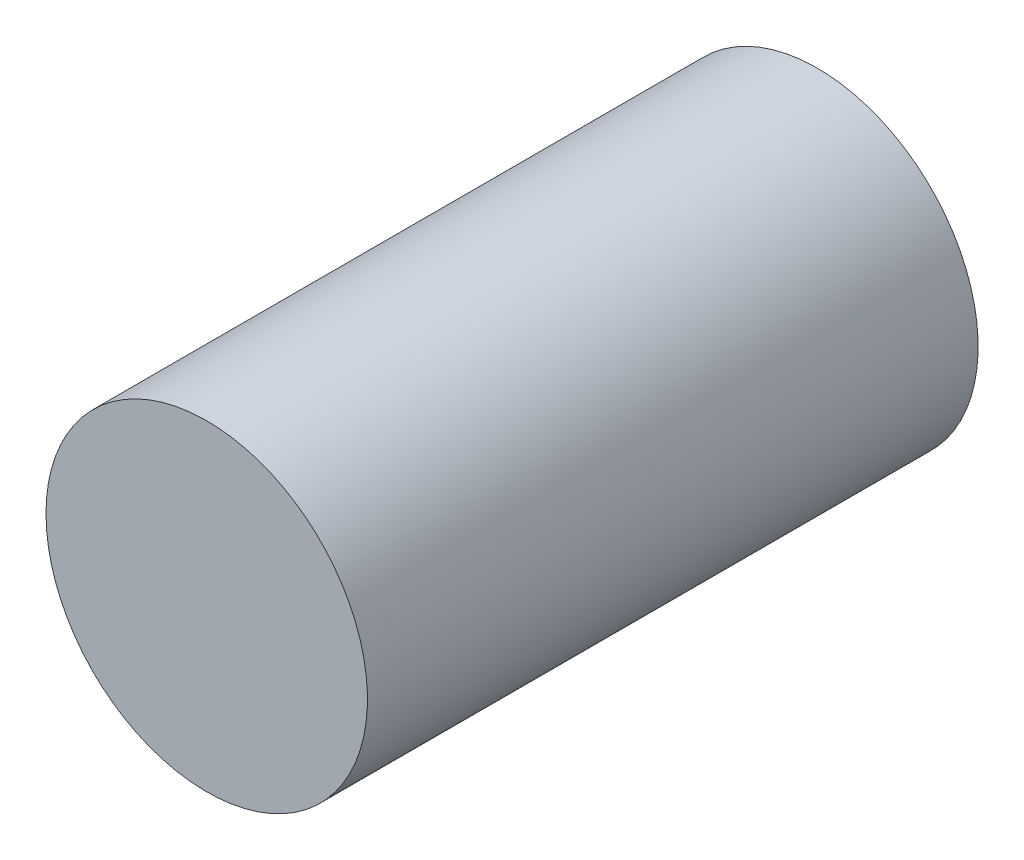
ISO-10303-21;
HEADER;
FILE_DESCRIPTION(('STEP AP214'),'2;1');
FILE_NAME('part.step','',(''),(''),'','','');
FILE_SCHEMA(('AUTOMOTIVE_DESIGN { 1 0 10303 214 1 1 1 1 }'));
ENDSEC;
DATA;
#1=APPLICATION_CONTEXT('core data for automotive mechanical design processes');
#2=APPLICATION_PROTOCOL_DEFINITION('international standard','automotive_design',2000,#1);
#3=PRODUCT_CONTEXT('',#1,'mechanical');
#4=PRODUCT('Part','Part','',(#3));
#5=PRODUCT_RELATED_PRODUCT_CATEGORY('part','',(#4));
#6=PRODUCT_DEFINITION_FORMATION('','',#4);
#7=PRODUCT_DEFINITION_CONTEXT('part definition',#1,'design');
#8=PRODUCT_DEFINITION('design','',#6,#7);
#9=PRODUCT_DEFINITION_SHAPE('','',#8);
#10=(LENGTH_UNIT() NAMED_UNIT(*) SI_UNIT(.MILLI.,.METRE.));
#11=(NAMED_UNIT(*) PLANE_ANGLE_UNIT() SI_UNIT($,.RADIAN.));
#12=(NAMED_UNIT(*) SI_UNIT($,.STERADIAN.) SOLID_ANGLE_UNIT());
#13=UNCERTAINTY_MEASURE_WITH_UNIT(LENGTH_MEASURE(1.E-05),#10,'distance_accuracy_value','');
#14=(GEOMETRIC_REPRESENTATION_CONTEXT(3) GLOBAL_UNCERTAINTY_ASSIGNED_CONTEXT((#13)) GLOBAL_UNIT_ASSIGNED_CONTEXT((#10,
#11,#12)) REPRESENTATION_CONTEXT('',''));
#15=CARTESIAN_POINT('',(0.,0.,0.));
#16=DIRECTION('',(0.,0.,1.));
#17=DIRECTION('',(1.,0.,0.));
#18=AXIS2_PLACEMENT_3D('',#15,#16,#17);
#19=CARTESIAN_POINT('',(0.,0.,3.8));
#20=DIRECTION('',(0.,0.,-1.));
#21=DIRECTION('',(-1.,0.,0.));
#22=AXIS2_PLACEMENT_3D('',#19,#20,#21);
#23=CYLINDRICAL_SURFACE('',#22,1.);
#24=CARTESIAN_POINT('',(0.,0.,3.8));
#25=DIRECTION('',(0.,0.,1.));
#26=DIRECTION('',(1.,0.,0.));
#27=AXIS2_PLACEMENT_3D('',#24,#25,#26);
#28=CIRCLE('',#27,1.);
#29=CARTESIAN_POINT('',(-1.,0.,3.8));
#30=VERTEX_POINT('',#29);
#31=EDGE_CURVE('E10',#30,#30,#28,.T.);
#32=CARTESIAN_POINT('',(0.,0.,0.));
#33=DIRECTION('',(0.,0.,1.));
#34=DIRECTION('',(1.,0.,0.));
#35=AXIS2_PLACEMENT_3D('',#32,#33,#34);
#36=CIRCLE('',#35,1.);
#37=CARTESIAN_POINT('',(-1.,0.,0.));
#38=VERTEX_POINT('',#37);
#39=EDGE_CURVE('E40',#38,#38,#36,.T.);
#40=CARTESIAN_POINT('',(-1.,0.,3.8));
#41=CARTESIAN_POINT('',(-1.,0.,3.76041666666667));
#42=CARTESIAN_POINT('',(-1.,0.,3.72083333333333));
#43=CARTESIAN_POINT('',(-1.,0.,3.64166666666667));
#44=CARTESIAN_POINT('',(-1.,0.,3.60208333333333));
#45=CARTESIAN_POINT('',(-1.,0.,3.52291666666667));
#46=CARTESIAN_POINT('',(-1.,0.,3.48333333333333));
#47=CARTESIAN_POINT('',(-1.,0.,3.40416666666667));
#48=CARTESIAN_POINT('',(-1.,0.,3.36458333333333));
#49=CARTESIAN_POINT('',(-1.,0.,3.28541666666667));
#50=CARTESIAN_POINT('',(-1.,0.,3.24583333333333));
#51=CARTESIAN_POINT('',(-1.,0.,3.16666666666667));
#52=CARTESIAN_POINT('',(-1.,0.,3.12708333333333));
#53=CARTESIAN_POINT('',(-1.,0.,3.04791666666667));
#54=CARTESIAN_POINT('',(-1.,0.,3.00833333333333));
#55=CARTESIAN_POINT('',(-1.,0.,2.92916666666667));
#56=CARTESIAN_POINT('',(-1.,0.,2.88958333333333));
#57=CARTESIAN_POINT('',(-1.,0.,2.81041666666667));
#58=CARTESIAN_POINT('',(-1.,0.,2.77083333333333));
#59=CARTESIAN_POINT('',(-1.,0.,2.69166666666667));
#60=CARTESIAN_POINT('',(-1.,0.,2.65208333333333));
#61=CARTESIAN_POINT('',(-1.,0.,2.57291666666667));
#62=CARTESIAN_POINT('',(-1.,0.,2.53333333333333));
#63=CARTESIAN_POINT('',(-1.,0.,2.45416666666667));
#64=CARTESIAN_POINT('',(-1.,0.,2.41458333333333));
#65=CARTESIAN_POINT('',(-1.,0.,2.33541666666667));
#66=CARTESIAN_POINT('',(-1.,0.,2.29583333333333));
#67=CARTESIAN_POINT('',(-1.,0.,2.21666666666667));
#68=CARTESIAN_POINT('',(-1.,0.,2.17708333333333));
#69=CARTESIAN_POINT('',(-1.,0.,2.09791666666667));
#70=CARTESIAN_POINT('',(-1.,0.,2.05833333333333));
#71=CARTESIAN_POINT('',(-1.,0.,1.97916666666667));
#72=CARTESIAN_POINT('',(-1.,0.,1.93958333333333));
#73=CARTESIAN_POINT('',(-1.,0.,1.86041666666667));
#74=CARTESIAN_POINT('',(-1.,0.,1.82083333333333));
#75=CARTESIAN_POINT('',(-1.,0.,1.74166666666667));
#76=CARTESIAN_POINT('',(-1.,0.,1.70208333333333));
#77=CARTESIAN_POINT('',(-1.,0.,1.62291666666667));
#78=CARTESIAN_POINT('',(-1.,0.,1.58333333333333));
#79=CARTESIAN_POINT('',(-1.,0.,1.50416666666667));
#80=CARTESIAN_POINT('',(-1.,0.,1.46458333333333));
#81=CARTESIAN_POINT('',(-1.,0.,1.38541666666667));
#82=CARTESIAN_POINT('',(-1.,0.,1.34583333333333));
#83=CARTESIAN_POINT('',(-1.,0.,1.26666666666667));
#84=CARTESIAN_POINT('',(-1.,0.,1.22708333333333));
#85=CARTESIAN_POINT('',(-1.,0.,1.14791666666667));
#86=CARTESIAN_POINT('',(-1.,0.,1.10833333333333));
#87=CARTESIAN_POINT('',(-1.,0.,1.02916666666667));
#88=CARTESIAN_POINT('',(-1.,0.,0.989583333333333));
#89=CARTESIAN_POINT('',(-1.,0.,0.910416666666667));
#90=CARTESIAN_POINT('',(-1.,0.,0.870833333333333));
#91=CARTESIAN_POINT('',(-1.,0.,0.791666666666667));
#92=CARTESIAN_POINT('',(-1.,0.,0.752083333333333));
#93=CARTESIAN_POINT('',(-1.,0.,0.672916666666667));
#94=CARTESIAN_POINT('',(-1.,0.,0.633333333333333));
#95=CARTESIAN_POINT('',(-1.,0.,0.554166666666667));
#96=CARTESIAN_POINT('',(-1.,0.,0.514583333333334));
#97=CARTESIAN_POINT('',(-1.,0.,0.435416666666667));
#98=CARTESIAN_POINT('',(-1.,0.,0.395833333333333));
#99=CARTESIAN_POINT('',(-1.,0.,0.316666666666666));
#100=CARTESIAN_POINT('',(-1.,0.,0.277083333333333));
#101=CARTESIAN_POINT('',(-1.,0.,0.197916666666667));
#102=CARTESIAN_POINT('',(-1.,0.,0.158333333333333));
#103=CARTESIAN_POINT('',(-1.,0.,0.0791666666666666));
#104=CARTESIAN_POINT('',(-1.,0.,0.0395833333333333));
#105=CARTESIAN_POINT('',(-1.,0.,0.));
#106=B_SPLINE_CURVE_WITH_KNOTS('',3,(#40,#41,#42,#43,#44,#45,#46,#47,#48,#49,#50,#51,#52,#53,
#54,#55,#56,#57,#58,#59,#60,#61,#62,#63,#64,#65,#66,#67,#68,#69,#70,#71,#72,#73,#74,#75,#76,#77,
#78,#79,#80,#81,#82,#83,#84,#85,#86,#87,#88,#89,#90,#91,#92,#93,#94,#95,#96,#97,#98,#99,#100,
#101,#102,#103,#104,#105),.UNSPECIFIED.,.F.,.F.,(4,2,2,2,2,2,2,2,2,2,2,2,2,2,2,2,2,2,2,2,2,2,2,
2,2,2,2,2,2,2,2,2,4),(0.,0.11875,0.2375,0.35625,0.475,0.59375,0.7125,0.831249999999999,0.95,
1.06875,1.1875,1.30625,1.425,1.54375,1.6625,1.78125,1.9,2.01875,2.1375,2.25625,2.375,2.49375,
2.6125,2.73125,2.85,2.96875,3.0875,3.20625,3.325,3.44375,3.5625,3.68125,3.8),.UNSPECIFIED.);
#107=EDGE_CURVE('BSEAM37',#30,#38,#106,.T.);
#108=ORIENTED_EDGE('',*,*,#31,.F.);
#109=ORIENTED_EDGE('',*,*,#39,.T.);
#110=ORIENTED_EDGE('',*,*,#107,.T.);
#111=ORIENTED_EDGE('',*,*,#107,.F.);
#112=EDGE_LOOP('',(#108,#110,#109,#111));
#113=FACE_BOUND('',#112,.T.);
#114=ADVANCED_FACE('F37',(#113),#23,.T.);
#115=CARTESIAN_POINT('',(0.,0.,3.8));
#116=DIRECTION('',(0.,0.,1.));
#117=DIRECTION('',(1.,0.,0.));
#118=AXIS2_PLACEMENT_3D('',#115,#116,#117);
#119=PLANE('',#118);
#120=ORIENTED_EDGE('',*,*,#31,.T.);
#121=EDGE_LOOP('',(#120));
#122=FACE_BOUND('',#121,.T.);
#123=ADVANCED_FACE('F52',(#122),#119,.T.);
#124=CARTESIAN_POINT('',(0.,0.,0.));
#125=DIRECTION('',(0.,0.,1.));
#126=DIRECTION('',(1.,0.,0.));
#127=AXIS2_PLACEMENT_3D('',#124,#125,#126);
#128=PLANE('',#127);
#129=ORIENTED_EDGE('',*,*,#39,.F.);
#130=EDGE_LOOP('',(#129));
#131=FACE_BOUND('',#130,.T.);
#132=ADVANCED_FACE('F50',(#131),#128,.F.);
#133=CLOSED_SHELL('',(#114,#123,#132));
#134=MANIFOLD_SOLID_BREP('B2',#133);
#135=ADVANCED_BREP_SHAPE_REPRESENTATION('',(#18,#134),#14);
#136=SHAPE_DEFINITION_REPRESENTATION(#9,#135);
ENDSEC;
END-ISO-10303-21;
